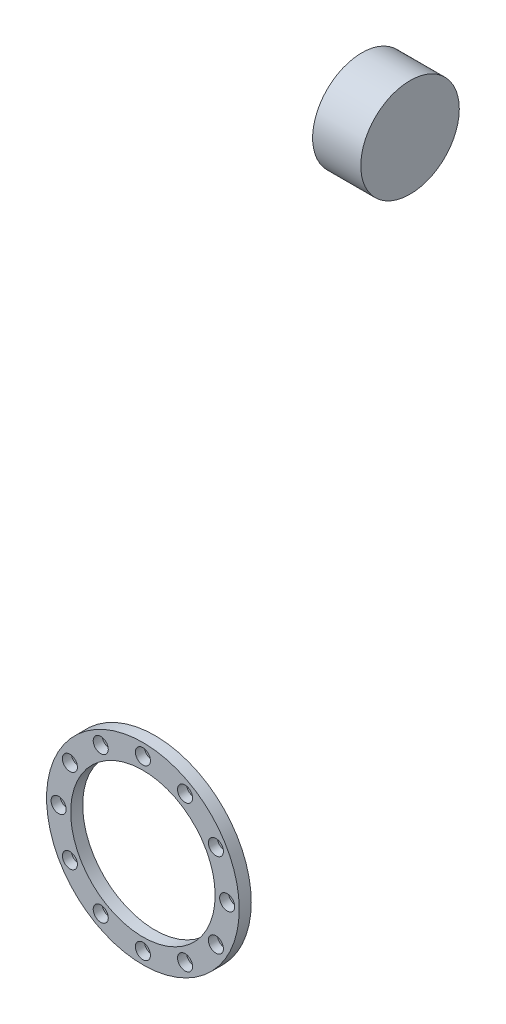
ISO-10303-21;
HEADER;
FILE_DESCRIPTION(('STEP AP214'),'2;1');
FILE_NAME('part.step','',(''),(''),'','','');
FILE_SCHEMA(('AUTOMOTIVE_DESIGN { 1 0 10303 214 1 1 1 1 }'));
ENDSEC;
DATA;
#1=APPLICATION_CONTEXT('core data for automotive mechanical design processes');
#2=APPLICATION_PROTOCOL_DEFINITION('international standard','automotive_design',2000,#1);
#3=PRODUCT_CONTEXT('',#1,'mechanical');
#4=PRODUCT('Part','Part','',(#3));
#5=PRODUCT_RELATED_PRODUCT_CATEGORY('part','',(#4));
#6=PRODUCT_DEFINITION_FORMATION('','',#4);
#7=PRODUCT_DEFINITION_CONTEXT('part definition',#1,'design');
#8=PRODUCT_DEFINITION('design','',#6,#7);
#9=PRODUCT_DEFINITION_SHAPE('','',#8);
#10=(LENGTH_UNIT() NAMED_UNIT(*) SI_UNIT(.MILLI.,.METRE.));
#11=(NAMED_UNIT(*) PLANE_ANGLE_UNIT() SI_UNIT($,.RADIAN.));
#12=(NAMED_UNIT(*) SI_UNIT($,.STERADIAN.) SOLID_ANGLE_UNIT());
#13=UNCERTAINTY_MEASURE_WITH_UNIT(LENGTH_MEASURE(1.E-05),#10,'distance_accuracy_value','');
#14=(GEOMETRIC_REPRESENTATION_CONTEXT(3) GLOBAL_UNCERTAINTY_ASSIGNED_CONTEXT((#13)) GLOBAL_UNIT_ASSIGNED_CONTEXT((#10,
#11,#12)) REPRESENTATION_CONTEXT('',''));
#15=CARTESIAN_POINT('',(0.,0.,0.));
#16=DIRECTION('',(0.,0.,1.));
#17=DIRECTION('',(1.,0.,0.));
#18=AXIS2_PLACEMENT_3D('',#15,#16,#17);
#19=CARTESIAN_POINT('',(25.4,538.724850834768,-243.653729545498));
#20=DIRECTION('',(-1.,0.,0.));
#21=DIRECTION('',(0.,0.,1.));
#22=AXIS2_PLACEMENT_3D('',#19,#20,#21);
#23=CYLINDRICAL_SURFACE('',#22,51.9453758681195);
#24=CARTESIAN_POINT('',(25.4,538.724850834768,-243.653729545498));
#25=DIRECTION('',(1.,0.,0.));
#26=DIRECTION('',(0.,0.,-1.));
#27=AXIS2_PLACEMENT_3D('',#24,#25,#26);
#28=CIRCLE('',#27,51.9453758681195);
#29=CARTESIAN_POINT('',(25.4,538.724850834768,-295.599105413618));
#30=VERTEX_POINT('',#29);
#31=EDGE_CURVE('E11',#30,#30,#28,.T.);
#32=ORIENTED_EDGE('',*,*,#31,.F.);
#33=EDGE_LOOP('',(#32));
#34=FACE_BOUND('',#33,.T.);
#35=CARTESIAN_POINT('',(-25.4,538.724850834768,-243.653729545498));
#36=DIRECTION('',(1.,0.,0.));
#37=DIRECTION('',(0.,0.,-1.));
#38=AXIS2_PLACEMENT_3D('',#35,#36,#37);
#39=CIRCLE('',#38,51.9453758681195);
#40=CARTESIAN_POINT('',(-25.4,538.724850834768,-295.599105413618));
#41=VERTEX_POINT('',#40);
#42=EDGE_CURVE('E49',#41,#41,#39,.T.);
#43=ORIENTED_EDGE('',*,*,#42,.T.);
#44=EDGE_LOOP('',(#43));
#45=FACE_BOUND('',#44,.T.);
#46=ADVANCED_FACE('F46',(#34,#45),#23,.T.);
#47=CARTESIAN_POINT('',(25.4,538.724850834768,-243.653729545498));
#48=DIRECTION('',(1.,0.,0.));
#49=DIRECTION('',(0.,0.,-1.));
#50=AXIS2_PLACEMENT_3D('',#47,#48,#49);
#51=PLANE('',#50);
#52=ORIENTED_EDGE('',*,*,#31,.T.);
#53=EDGE_LOOP('',(#52));
#54=FACE_BOUND('',#53,.T.);
#55=ADVANCED_FACE('F61',(#54),#51,.T.);
#56=CARTESIAN_POINT('',(-25.4,538.724850834768,-243.653729545498));
#57=DIRECTION('',(1.,0.,0.));
#58=DIRECTION('',(0.,0.,-1.));
#59=AXIS2_PLACEMENT_3D('',#56,#57,#58);
#60=PLANE('',#59);
#61=ORIENTED_EDGE('',*,*,#42,.F.);
#62=EDGE_LOOP('',(#61));
#63=FACE_BOUND('',#62,.T.);
#64=ADVANCED_FACE('F59',(#63),#60,.F.);
#65=CLOSED_SHELL('',(#46,#55,#64));
#66=MANIFOLD_SOLID_BREP('B2',#65);
#67=CARTESIAN_POINT('',(0.,0.,12.7));
#68=DIRECTION('',(0.,0.,1.));
#69=DIRECTION('',(1.,0.,0.));
#70=AXIS2_PLACEMENT_3D('',#67,#68,#69);
#71=PLANE('',#70);
#72=CARTESIAN_POINT('',(-76.9896583964367,44.4499999999998,12.7));
#73=DIRECTION('',(0.,0.,1.));
#74=DIRECTION('',(0.499999999999998,0.86602540378444,0.));
#75=AXIS2_PLACEMENT_3D('',#72,#73,#74);
#76=CIRCLE('',#75,7.9375);
#77=CARTESIAN_POINT('',(-73.0209083964367,51.3240766425388,12.7));
#78=VERTEX_POINT('',#77);
#79=EDGE_CURVE('E213',#78,#78,#76,.T.);
#80=ORIENTED_EDGE('',*,*,#79,.F.);
#81=EDGE_LOOP('',(#80));
#82=FACE_BOUND('',#81,.T.);
#83=CARTESIAN_POINT('',(-88.9,-3.10392691023155E-13,12.7));
#84=DIRECTION('',(0.,0.,1.));
#85=DIRECTION('',(0.,1.,0.));
#86=AXIS2_PLACEMENT_3D('',#83,#84,#85);
#87=CIRCLE('',#86,7.9375);
#88=CARTESIAN_POINT('',(-88.9,7.93749999999969,12.7));
#89=VERTEX_POINT('',#88);
#90=EDGE_CURVE('E201',#89,#89,#87,.T.);
#91=ORIENTED_EDGE('',*,*,#90,.F.);
#92=EDGE_LOOP('',(#91));
#93=FACE_BOUND('',#92,.T.);
#94=CARTESIAN_POINT('',(-76.9896583964364,-44.4500000000004,12.7));
#95=DIRECTION('',(0.,0.,1.));
#96=DIRECTION('',(-0.500000000000004,0.866025403784436,0.));
#97=AXIS2_PLACEMENT_3D('',#94,#95,#96);
#98=CIRCLE('',#97,7.9375);
#99=CARTESIAN_POINT('',(-80.9584083964364,-37.5759233574614,12.7));
#100=VERTEX_POINT('',#99);
#101=EDGE_CURVE('E189',#100,#100,#98,.T.);
#102=ORIENTED_EDGE('',*,*,#101,.F.);
#103=EDGE_LOOP('',(#102));
#104=FACE_BOUND('',#103,.T.);
#105=CARTESIAN_POINT('',(-44.4499999999995,-76.9896583964369,12.7));
#106=DIRECTION('',(0.,0.,1.));
#107=DIRECTION('',(-0.866025403784442,0.499999999999995,0.));
#108=AXIS2_PLACEMENT_3D('',#105,#106,#107);
#109=CIRCLE('',#108,7.9375);
#110=CARTESIAN_POINT('',(-51.3240766425386,-73.0209083964369,12.7));
#111=VERTEX_POINT('',#110);
#112=EDGE_CURVE('E177',#111,#111,#109,.T.);
#113=ORIENTED_EDGE('',*,*,#112,.F.);
#114=EDGE_LOOP('',(#113));
#115=FACE_BOUND('',#114,.T.);
#116=CARTESIAN_POINT('',(0.,-88.9,12.7));
#117=DIRECTION('',(0.,0.,1.));
#118=DIRECTION('',(-1.,0.,0.));
#119=AXIS2_PLACEMENT_3D('',#116,#117,#118);
#120=CIRCLE('',#119,7.9375);
#121=CARTESIAN_POINT('',(-7.9375,-88.9,12.7));
#122=VERTEX_POINT('',#121);
#123=EDGE_CURVE('E165',#122,#122,#120,.T.);
#124=ORIENTED_EDGE('',*,*,#123,.F.);
#125=EDGE_LOOP('',(#124));
#126=FACE_BOUND('',#125,.T.);
#127=CARTESIAN_POINT('',(44.4500000000006,-76.9896583964362,12.7));
#128=DIRECTION('',(0.,0.,1.));
#129=DIRECTION('',(-0.866025403784435,-0.500000000000007,0.));
#130=AXIS2_PLACEMENT_3D('',#127,#128,#129);
#131=CIRCLE('',#130,7.9375);
#132=CARTESIAN_POINT('',(37.5759233574617,-80.9584083964363,12.7));
#133=VERTEX_POINT('',#132);
#134=EDGE_CURVE('E153',#133,#133,#131,.T.);
#135=ORIENTED_EDGE('',*,*,#134,.F.);
#136=EDGE_LOOP('',(#135));
#137=FACE_BOUND('',#136,.T.);
#138=CARTESIAN_POINT('',(76.989658396437,-44.4499999999993,12.7));
#139=DIRECTION('',(0.,0.,1.));
#140=DIRECTION('',(-0.499999999999992,-0.866025403784443,0.));
#141=AXIS2_PLACEMENT_3D('',#138,#139,#140);
#142=CIRCLE('',#141,7.9375);
#143=CARTESIAN_POINT('',(73.0209083964371,-51.3240766425383,12.7));
#144=VERTEX_POINT('',#143);
#145=EDGE_CURVE('E139',#144,#144,#142,.T.);
#146=ORIENTED_EDGE('',*,*,#145,.F.);
#147=EDGE_LOOP('',(#146));
#148=FACE_BOUND('',#147,.T.);
#149=CARTESIAN_POINT('',(88.9,9.31178073069464E-13,12.7));
#150=DIRECTION('',(0.,0.,1.));
#151=DIRECTION('',(0.,-1.,0.));
#152=AXIS2_PLACEMENT_3D('',#149,#150,#151);
#153=CIRCLE('',#152,7.9375);
#154=CARTESIAN_POINT('',(88.9000000000001,-7.93749999999907,12.7));
#155=VERTEX_POINT('',#154);
#156=EDGE_CURVE('E146',#155,#155,#153,.T.);
#157=ORIENTED_EDGE('',*,*,#156,.F.);
#158=EDGE_LOOP('',(#157));
#159=FACE_BOUND('',#158,.T.);
#160=CARTESIAN_POINT('',(76.9896583964361,44.4500000000009,12.7));
#161=DIRECTION('',(0.,0.,1.));
#162=DIRECTION('',(0.50000000000001,-0.866025403784433,0.));
#163=AXIS2_PLACEMENT_3D('',#160,#161,#162);
#164=CIRCLE('',#163,7.9375);
#165=CARTESIAN_POINT('',(80.9584083964361,37.575923357462,12.7));
#166=VERTEX_POINT('',#165);
#167=EDGE_CURVE('E235',#166,#166,#164,.T.);
#168=ORIENTED_EDGE('',*,*,#167,.F.);
#169=EDGE_LOOP('',(#168));
#170=FACE_BOUND('',#169,.T.);
#171=CARTESIAN_POINT('',(44.449999999999,76.9896583964372,12.7));
#172=DIRECTION('',(0.,0.,1.));
#173=DIRECTION('',(0.866025403784445,-0.499999999999989,0.));
#174=AXIS2_PLACEMENT_3D('',#171,#172,#173);
#175=CIRCLE('',#174,7.9375);
#176=CARTESIAN_POINT('',(51.324076642538,73.0209083964372,12.7));
#177=VERTEX_POINT('',#176);
#178=EDGE_CURVE('E242',#177,#177,#175,.T.);
#179=ORIENTED_EDGE('',*,*,#178,.F.);
#180=EDGE_LOOP('',(#179));
#181=FACE_BOUND('',#180,.T.);
#182=CARTESIAN_POINT('',(-44.4500000000001,76.9896583964365,12.7));
#183=DIRECTION('',(0.,0.,1.));
#184=DIRECTION('',(0.866025403784438,0.500000000000001,0.));
#185=AXIS2_PLACEMENT_3D('',#182,#183,#184);
#186=CIRCLE('',#185,7.9375);
#187=CARTESIAN_POINT('',(-37.5759233574611,80.9584083964365,12.7));
#188=VERTEX_POINT('',#187);
#189=EDGE_CURVE('E132',#188,#188,#186,.T.);
#190=ORIENTED_EDGE('',*,*,#189,.F.);
#191=EDGE_LOOP('',(#190));
#192=FACE_BOUND('',#191,.T.);
#193=CARTESIAN_POINT('',(0.,88.9,12.7));
#194=DIRECTION('',(0.,0.,1.));
#195=DIRECTION('',(1.,0.,0.));
#196=AXIS2_PLACEMENT_3D('',#193,#194,#195);
#197=CIRCLE('',#196,7.9375);
#198=CARTESIAN_POINT('',(7.9375,88.9,12.7));
#199=VERTEX_POINT('',#198);
#200=EDGE_CURVE('E120',#199,#199,#197,.T.);
#201=ORIENTED_EDGE('',*,*,#200,.F.);
#202=EDGE_LOOP('',(#201));
#203=FACE_BOUND('',#202,.T.);
#204=CARTESIAN_POINT('',(0.,0.,12.7));
#205=DIRECTION('',(0.,0.,1.));
#206=DIRECTION('',(1.,0.,0.));
#207=AXIS2_PLACEMENT_3D('',#204,#205,#206);
#208=CIRCLE('',#207,101.6);
#209=CARTESIAN_POINT('',(101.6,0.,12.7));
#210=VERTEX_POINT('',#209);
#211=EDGE_CURVE('E45',#210,#210,#208,.T.);
#212=ORIENTED_EDGE('',*,*,#211,.T.);
#213=EDGE_LOOP('',(#212));
#214=FACE_BOUND('',#213,.T.);
#215=CARTESIAN_POINT('',(0.,0.,12.7));
#216=DIRECTION('',(0.,0.,1.));
#217=DIRECTION('',(1.,0.,0.));
#218=AXIS2_PLACEMENT_3D('',#215,#216,#217);
#219=CIRCLE('',#218,76.2);
#220=CARTESIAN_POINT('',(76.2,0.,12.7));
#221=VERTEX_POINT('',#220);
#222=EDGE_CURVE('E104',#221,#221,#219,.T.);
#223=ORIENTED_EDGE('',*,*,#222,.F.);
#224=EDGE_LOOP('',(#223));
#225=FACE_BOUND('',#224,.T.);
#226=ADVANCED_FACE('F93',(#82,#93,#104,#115,#126,#137,#148,#159,#170,#181,#192,#203,#214,#225),
#71,.T.);
#227=CARTESIAN_POINT('',(0.,0.,0.));
#228=DIRECTION('',(0.,0.,1.));
#229=DIRECTION('',(1.,0.,0.));
#230=AXIS2_PLACEMENT_3D('',#227,#228,#229);
#231=PLANE('',#230);
#232=CARTESIAN_POINT('',(-76.9896583964367,44.4499999999998,0.));
#233=DIRECTION('',(0.,0.,1.));
#234=DIRECTION('',(0.499999999999998,0.86602540378444,0.));
#235=AXIS2_PLACEMENT_3D('',#232,#233,#234);
#236=CIRCLE('',#235,5.0419);
#237=CARTESIAN_POINT('',(-74.4687083964367,48.8164134833406,0.));
#238=VERTEX_POINT('',#237);
#239=EDGE_CURVE('E227',#238,#238,#236,.T.);
#240=ORIENTED_EDGE('',*,*,#239,.T.);
#241=EDGE_LOOP('',(#240));
#242=FACE_BOUND('',#241,.T.);
#243=CARTESIAN_POINT('',(-88.9,-3.10392691023155E-13,0.));
#244=DIRECTION('',(0.,0.,1.));
#245=DIRECTION('',(0.,1.,0.));
#246=AXIS2_PLACEMENT_3D('',#243,#244,#245);
#247=CIRCLE('',#246,5.0419);
#248=CARTESIAN_POINT('',(-88.9,5.04189999999969,0.));
#249=VERTEX_POINT('',#248);
#250=EDGE_CURVE('E217',#249,#249,#247,.T.);
#251=ORIENTED_EDGE('',*,*,#250,.T.);
#252=EDGE_LOOP('',(#251));
#253=FACE_BOUND('',#252,.T.);
#254=CARTESIAN_POINT('',(-76.9896583964364,-44.4500000000004,0.));
#255=DIRECTION('',(0.,0.,1.));
#256=DIRECTION('',(-0.500000000000004,0.866025403784436,0.));
#257=AXIS2_PLACEMENT_3D('',#254,#255,#256);
#258=CIRCLE('',#257,5.0419);
#259=CARTESIAN_POINT('',(-79.5106083964364,-40.0835865166596,0.));
#260=VERTEX_POINT('',#259);
#261=EDGE_CURVE('E205',#260,#260,#258,.T.);
#262=ORIENTED_EDGE('',*,*,#261,.T.);
#263=EDGE_LOOP('',(#262));
#264=FACE_BOUND('',#263,.T.);
#265=CARTESIAN_POINT('',(-44.4499999999995,-76.9896583964369,0.));
#266=DIRECTION('',(0.,0.,1.));
#267=DIRECTION('',(-0.866025403784442,0.499999999999995,0.));
#268=AXIS2_PLACEMENT_3D('',#265,#266,#267);
#269=CIRCLE('',#268,5.0419);
#270=CARTESIAN_POINT('',(-48.8164134833403,-74.4687083964369,0.));
#271=VERTEX_POINT('',#270);
#272=EDGE_CURVE('E193',#271,#271,#269,.T.);
#273=ORIENTED_EDGE('',*,*,#272,.T.);
#274=EDGE_LOOP('',(#273));
#275=FACE_BOUND('',#274,.T.);
#276=CARTESIAN_POINT('',(0.,-88.9,0.));
#277=DIRECTION('',(0.,0.,1.));
#278=DIRECTION('',(-1.,0.,0.));
#279=AXIS2_PLACEMENT_3D('',#276,#277,#278);
#280=CIRCLE('',#279,5.0419);
#281=CARTESIAN_POINT('',(-5.0419,-88.9,0.));
#282=VERTEX_POINT('',#281);
#283=EDGE_CURVE('E181',#282,#282,#280,.T.);
#284=ORIENTED_EDGE('',*,*,#283,.T.);
#285=EDGE_LOOP('',(#284));
#286=FACE_BOUND('',#285,.T.);
#287=CARTESIAN_POINT('',(44.4500000000006,-76.9896583964362,0.));
#288=DIRECTION('',(0.,0.,1.));
#289=DIRECTION('',(-0.866025403784435,-0.500000000000007,0.));
#290=AXIS2_PLACEMENT_3D('',#287,#288,#289);
#291=CIRCLE('',#290,5.0419);
#292=CARTESIAN_POINT('',(40.0835865166599,-79.5106083964363,0.));
#293=VERTEX_POINT('',#292);
#294=EDGE_CURVE('E169',#293,#293,#291,.T.);
#295=ORIENTED_EDGE('',*,*,#294,.T.);
#296=EDGE_LOOP('',(#295));
#297=FACE_BOUND('',#296,.T.);
#298=CARTESIAN_POINT('',(76.989658396437,-44.4499999999993,0.));
#299=DIRECTION('',(0.,0.,1.));
#300=DIRECTION('',(-0.499999999999992,-0.866025403784443,0.));
#301=AXIS2_PLACEMENT_3D('',#298,#299,#300);
#302=CIRCLE('',#301,5.0419);
#303=CARTESIAN_POINT('',(74.4687083964371,-48.8164134833401,0.));
#304=VERTEX_POINT('',#303);
#305=EDGE_CURVE('E157',#304,#304,#302,.T.);
#306=ORIENTED_EDGE('',*,*,#305,.T.);
#307=EDGE_LOOP('',(#306));
#308=FACE_BOUND('',#307,.T.);
#309=CARTESIAN_POINT('',(88.9,9.31178073069464E-13,0.));
#310=DIRECTION('',(0.,0.,1.));
#311=DIRECTION('',(0.,-1.,0.));
#312=AXIS2_PLACEMENT_3D('',#309,#310,#311);
#313=CIRCLE('',#312,5.0419);
#314=CARTESIAN_POINT('',(88.9,-5.04189999999906,0.));
#315=VERTEX_POINT('',#314);
#316=EDGE_CURVE('E143',#315,#315,#313,.T.);
#317=ORIENTED_EDGE('',*,*,#316,.T.);
#318=EDGE_LOOP('',(#317));
#319=FACE_BOUND('',#318,.T.);
#320=CARTESIAN_POINT('',(76.9896583964361,44.4500000000009,0.));
#321=DIRECTION('',(0.,0.,1.));
#322=DIRECTION('',(0.50000000000001,-0.866025403784433,0.));
#323=AXIS2_PLACEMENT_3D('',#320,#321,#322);
#324=CIRCLE('',#323,5.0419);
#325=CARTESIAN_POINT('',(79.5106083964361,40.0835865166602,0.));
#326=VERTEX_POINT('',#325);
#327=EDGE_CURVE('E250',#326,#326,#324,.T.);
#328=ORIENTED_EDGE('',*,*,#327,.T.);
#329=EDGE_LOOP('',(#328));
#330=FACE_BOUND('',#329,.T.);
#331=CARTESIAN_POINT('',(44.449999999999,76.9896583964372,0.));
#332=DIRECTION('',(0.,0.,1.));
#333=DIRECTION('',(0.866025403784445,-0.499999999999989,0.));
#334=AXIS2_PLACEMENT_3D('',#331,#332,#333);
#335=CIRCLE('',#334,5.0419);
#336=CARTESIAN_POINT('',(48.8164134833398,74.4687083964372,0.));
#337=VERTEX_POINT('',#336);
#338=EDGE_CURVE('E239',#337,#337,#335,.T.);
#339=ORIENTED_EDGE('',*,*,#338,.T.);
#340=EDGE_LOOP('',(#339));
#341=FACE_BOUND('',#340,.T.);
#342=CARTESIAN_POINT('',(-44.4500000000001,76.9896583964365,0.));
#343=DIRECTION('',(0.,0.,1.));
#344=DIRECTION('',(0.866025403784438,0.500000000000001,0.));
#345=AXIS2_PLACEMENT_3D('',#342,#343,#344);
#346=CIRCLE('',#345,5.0419);
#347=CARTESIAN_POINT('',(-40.0835865166593,79.5106083964366,0.));
#348=VERTEX_POINT('',#347);
#349=EDGE_CURVE('E129',#348,#348,#346,.T.);
#350=ORIENTED_EDGE('',*,*,#349,.T.);
#351=EDGE_LOOP('',(#350));
#352=FACE_BOUND('',#351,.T.);
#353=CARTESIAN_POINT('',(0.,88.9,0.));
#354=DIRECTION('',(0.,0.,1.));
#355=DIRECTION('',(1.,0.,0.));
#356=AXIS2_PLACEMENT_3D('',#353,#354,#355);
#357=CIRCLE('',#356,5.0419);
#358=CARTESIAN_POINT('',(5.0419,88.9,0.));
#359=VERTEX_POINT('',#358);
#360=EDGE_CURVE('E109',#359,#359,#357,.T.);
#361=ORIENTED_EDGE('',*,*,#360,.T.);
#362=EDGE_LOOP('',(#361));
#363=FACE_BOUND('',#362,.T.);
#364=CARTESIAN_POINT('',(0.,0.,0.));
#365=DIRECTION('',(0.,0.,1.));
#366=DIRECTION('',(1.,0.,0.));
#367=AXIS2_PLACEMENT_3D('',#364,#365,#366);
#368=CIRCLE('',#367,101.6);
#369=CARTESIAN_POINT('',(101.6,0.,0.));
#370=VERTEX_POINT('',#369);
#371=EDGE_CURVE('E97',#370,#370,#368,.T.);
#372=ORIENTED_EDGE('',*,*,#371,.F.);
#373=EDGE_LOOP('',(#372));
#374=FACE_BOUND('',#373,.T.);
#375=CARTESIAN_POINT('',(0.,0.,0.));
#376=DIRECTION('',(0.,0.,1.));
#377=DIRECTION('',(1.,0.,0.));
#378=AXIS2_PLACEMENT_3D('',#375,#376,#377);
#379=CIRCLE('',#378,76.2);
#380=CARTESIAN_POINT('',(76.2,0.,0.));
#381=VERTEX_POINT('',#380);
#382=EDGE_CURVE('E106',#381,#381,#379,.T.);
#383=ORIENTED_EDGE('',*,*,#382,.T.);
#384=EDGE_LOOP('',(#383));
#385=FACE_BOUND('',#384,.T.);
#386=ADVANCED_FACE('F260',(#242,#253,#264,#275,#286,#297,#308,#319,#330,#341,#352,#363,#374,
#385),#231,.F.);
#387=CARTESIAN_POINT('',(0.,0.,12.7));
#388=DIRECTION('',(0.,0.,-1.));
#389=DIRECTION('',(-1.,0.,0.));
#390=AXIS2_PLACEMENT_3D('',#387,#388,#389);
#391=CYLINDRICAL_SURFACE('',#390,101.6);
#392=ORIENTED_EDGE('',*,*,#211,.F.);
#393=EDGE_LOOP('',(#392));
#394=FACE_BOUND('',#393,.T.);
#395=ORIENTED_EDGE('',*,*,#371,.T.);
#396=EDGE_LOOP('',(#395));
#397=FACE_BOUND('',#396,.T.);
#398=ADVANCED_FACE('F95',(#394,#397),#391,.T.);
#399=CARTESIAN_POINT('',(0.,0.,12.7));
#400=DIRECTION('',(0.,0.,-1.));
#401=DIRECTION('',(-1.,0.,0.));
#402=AXIS2_PLACEMENT_3D('',#399,#400,#401);
#403=CYLINDRICAL_SURFACE('',#402,76.2);
#404=ORIENTED_EDGE('',*,*,#222,.T.);
#405=EDGE_LOOP('',(#404));
#406=FACE_BOUND('',#405,.T.);
#407=ORIENTED_EDGE('',*,*,#382,.F.);
#408=EDGE_LOOP('',(#407));
#409=FACE_BOUND('',#408,.T.);
#410=ADVANCED_FACE('F271',(#406,#409),#403,.F.);
#411=CARTESIAN_POINT('',(0.,88.9,12.7));
#412=DIRECTION('',(0.,0.,1.));
#413=DIRECTION('',(1.,0.,0.));
#414=AXIS2_PLACEMENT_3D('',#411,#412,#413);
#415=CYLINDRICAL_SURFACE('',#414,5.0419);
#416=ORIENTED_EDGE('',*,*,#360,.F.);
#417=EDGE_LOOP('',(#416));
#418=FACE_BOUND('',#417,.T.);
#419=CARTESIAN_POINT('',(0.,88.9,3.175));
#420=DIRECTION('',(0.,0.,1.));
#421=DIRECTION('',(1.,0.,0.));
#422=AXIS2_PLACEMENT_3D('',#419,#420,#421);
#423=CIRCLE('',#422,5.0419);
#424=CARTESIAN_POINT('',(5.0419,88.9,3.175));
#425=VERTEX_POINT('',#424);
#426=EDGE_CURVE('E114',#425,#425,#423,.T.);
#427=ORIENTED_EDGE('',*,*,#426,.T.);
#428=EDGE_LOOP('',(#427));
#429=FACE_BOUND('',#428,.T.);
#430=ADVANCED_FACE('F274',(#418,#429),#415,.F.);
#431=CARTESIAN_POINT('',(5.0419,88.9,3.175));
#432=DIRECTION('',(0.,0.,-1.));
#433=DIRECTION('',(-1.,0.,0.));
#434=AXIS2_PLACEMENT_3D('',#431,#432,#433);
#435=PLANE('',#434);
#436=ORIENTED_EDGE('',*,*,#426,.F.);
#437=EDGE_LOOP('',(#436));
#438=FACE_BOUND('',#437,.T.);
#439=CARTESIAN_POINT('',(0.,88.9,3.175));
#440=DIRECTION('',(0.,0.,1.));
#441=DIRECTION('',(1.,0.,0.));
#442=AXIS2_PLACEMENT_3D('',#439,#440,#441);
#443=CIRCLE('',#442,7.9375);
#444=CARTESIAN_POINT('',(7.9375,88.9,3.175));
#445=VERTEX_POINT('',#444);
#446=EDGE_CURVE('E117',#445,#445,#443,.T.);
#447=ORIENTED_EDGE('',*,*,#446,.T.);
#448=EDGE_LOOP('',(#447));
#449=FACE_BOUND('',#448,.T.);
#450=ADVANCED_FACE('F288',(#438,#449),#435,.F.);
#451=CARTESIAN_POINT('',(0.,88.9,12.7));
#452=DIRECTION('',(0.,0.,1.));
#453=DIRECTION('',(1.,0.,0.));
#454=AXIS2_PLACEMENT_3D('',#451,#452,#453);
#455=CYLINDRICAL_SURFACE('',#454,7.9375);
#456=ORIENTED_EDGE('',*,*,#446,.F.);
#457=EDGE_LOOP('',(#456));
#458=FACE_BOUND('',#457,.T.);
#459=ORIENTED_EDGE('',*,*,#200,.T.);
#460=EDGE_LOOP('',(#459));
#461=FACE_BOUND('',#460,.T.);
#462=ADVANCED_FACE('F292',(#458,#461),#455,.F.);
#463=CARTESIAN_POINT('',(-44.4500000000001,76.9896583964365,12.7));
#464=DIRECTION('',(0.,0.,1.));
#465=DIRECTION('',(0.866025403784438,0.500000000000001,0.));
#466=AXIS2_PLACEMENT_3D('',#463,#464,#465);
#467=CYLINDRICAL_SURFACE('',#466,5.0419);
#468=ORIENTED_EDGE('',*,*,#349,.F.);
#469=EDGE_LOOP('',(#468));
#470=FACE_BOUND('',#469,.T.);
#471=CARTESIAN_POINT('',(-44.4500000000001,76.9896583964365,3.175));
#472=DIRECTION('',(0.,0.,1.));
#473=DIRECTION('',(0.866025403784438,0.500000000000001,0.));
#474=AXIS2_PLACEMENT_3D('',#471,#472,#473);
#475=CIRCLE('',#474,5.0419);
#476=CARTESIAN_POINT('',(-40.0835865166593,79.5106083964366,3.175));
#477=VERTEX_POINT('',#476);
#478=EDGE_CURVE('E123',#477,#477,#475,.T.);
#479=ORIENTED_EDGE('',*,*,#478,.T.);
#480=EDGE_LOOP('',(#479));
#481=FACE_BOUND('',#480,.T.);
#482=ADVANCED_FACE('F296',(#470,#481),#467,.F.);
#483=CARTESIAN_POINT('',(-40.0835865166593,79.5106083964366,3.175));
#484=DIRECTION('',(0.,0.,-1.));
#485=DIRECTION('',(-0.866025403784438,-0.500000000000001,0.));
#486=AXIS2_PLACEMENT_3D('',#483,#484,#485);
#487=PLANE('',#486);
#488=ORIENTED_EDGE('',*,*,#478,.F.);
#489=EDGE_LOOP('',(#488));
#490=FACE_BOUND('',#489,.T.);
#491=CARTESIAN_POINT('',(-44.4500000000001,76.9896583964365,3.175));
#492=DIRECTION('',(0.,0.,1.));
#493=DIRECTION('',(0.866025403784438,0.500000000000001,0.));
#494=AXIS2_PLACEMENT_3D('',#491,#492,#493);
#495=CIRCLE('',#494,7.9375);
#496=CARTESIAN_POINT('',(-37.5759233574611,80.9584083964365,3.175));
#497=VERTEX_POINT('',#496);
#498=EDGE_CURVE('E126',#497,#497,#495,.T.);
#499=ORIENTED_EDGE('',*,*,#498,.T.);
#500=EDGE_LOOP('',(#499));
#501=FACE_BOUND('',#500,.T.);
#502=ADVANCED_FACE('F300',(#490,#501),#487,.F.);
#503=CARTESIAN_POINT('',(-44.4500000000001,76.9896583964365,12.7));
#504=DIRECTION('',(0.,0.,1.));
#505=DIRECTION('',(0.866025403784438,0.500000000000001,0.));
#506=AXIS2_PLACEMENT_3D('',#503,#504,#505);
#507=CYLINDRICAL_SURFACE('',#506,7.9375);
#508=ORIENTED_EDGE('',*,*,#498,.F.);
#509=EDGE_LOOP('',(#508));
#510=FACE_BOUND('',#509,.T.);
#511=ORIENTED_EDGE('',*,*,#189,.T.);
#512=EDGE_LOOP('',(#511));
#513=FACE_BOUND('',#512,.T.);
#514=ADVANCED_FACE('F304',(#510,#513),#507,.F.);
#515=CARTESIAN_POINT('',(44.449999999999,76.9896583964372,12.7));
#516=DIRECTION('',(0.,0.,1.));
#517=DIRECTION('',(0.866025403784445,-0.499999999999989,0.));
#518=AXIS2_PLACEMENT_3D('',#515,#516,#517);
#519=CYLINDRICAL_SURFACE('',#518,5.0419);
#520=ORIENTED_EDGE('',*,*,#338,.F.);
#521=EDGE_LOOP('',(#520));
#522=FACE_BOUND('',#521,.T.);
#523=CARTESIAN_POINT('',(44.449999999999,76.9896583964372,3.175));
#524=DIRECTION('',(0.,0.,1.));
#525=DIRECTION('',(0.866025403784445,-0.499999999999989,0.));
#526=AXIS2_PLACEMENT_3D('',#523,#524,#525);
#527=CIRCLE('',#526,5.0419);
#528=CARTESIAN_POINT('',(48.8164134833398,74.4687083964372,3.175));
#529=VERTEX_POINT('',#528);
#530=EDGE_CURVE('E232',#529,#529,#527,.T.);
#531=ORIENTED_EDGE('',*,*,#530,.T.);
#532=EDGE_LOOP('',(#531));
#533=FACE_BOUND('',#532,.T.);
#534=ADVANCED_FACE('F308',(#522,#533),#519,.F.);
#535=CARTESIAN_POINT('',(48.8164134833398,74.4687083964372,3.175));
#536=DIRECTION('',(0.,0.,-1.));
#537=DIRECTION('',(-0.866025403784445,0.499999999999989,0.));
#538=AXIS2_PLACEMENT_3D('',#535,#536,#537);
#539=PLANE('',#538);
#540=ORIENTED_EDGE('',*,*,#530,.F.);
#541=EDGE_LOOP('',(#540));
#542=FACE_BOUND('',#541,.T.);
#543=CARTESIAN_POINT('',(44.449999999999,76.9896583964372,3.175));
#544=DIRECTION('',(0.,0.,1.));
#545=DIRECTION('',(0.866025403784445,-0.499999999999989,0.));
#546=AXIS2_PLACEMENT_3D('',#543,#544,#545);
#547=CIRCLE('',#546,7.9375);
#548=CARTESIAN_POINT('',(51.324076642538,73.0209083964372,3.175));
#549=VERTEX_POINT('',#548);
#550=EDGE_CURVE('E236',#549,#549,#547,.T.);
#551=ORIENTED_EDGE('',*,*,#550,.T.);
#552=EDGE_LOOP('',(#551));
#553=FACE_BOUND('',#552,.T.);
#554=ADVANCED_FACE('F408',(#542,#553),#539,.F.);
#555=CARTESIAN_POINT('',(44.449999999999,76.9896583964372,12.7));
#556=DIRECTION('',(0.,0.,1.));
#557=DIRECTION('',(0.866025403784445,-0.499999999999989,0.));
#558=AXIS2_PLACEMENT_3D('',#555,#556,#557);
#559=CYLINDRICAL_SURFACE('',#558,7.9375);
#560=ORIENTED_EDGE('',*,*,#550,.F.);
#561=EDGE_LOOP('',(#560));
#562=FACE_BOUND('',#561,.T.);
#563=ORIENTED_EDGE('',*,*,#178,.T.);
#564=EDGE_LOOP('',(#563));
#565=FACE_BOUND('',#564,.T.);
#566=ADVANCED_FACE('F412',(#562,#565),#559,.F.);
#567=CARTESIAN_POINT('',(76.9896583964361,44.4500000000009,12.7));
#568=DIRECTION('',(0.,0.,1.));
#569=DIRECTION('',(0.50000000000001,-0.866025403784433,0.));
#570=AXIS2_PLACEMENT_3D('',#567,#568,#569);
#571=CYLINDRICAL_SURFACE('',#570,5.0419);
#572=ORIENTED_EDGE('',*,*,#327,.F.);
#573=EDGE_LOOP('',(#572));
#574=FACE_BOUND('',#573,.T.);
#575=CARTESIAN_POINT('',(76.9896583964361,44.4500000000009,3.175));
#576=DIRECTION('',(0.,0.,1.));
#577=DIRECTION('',(0.50000000000001,-0.866025403784433,0.));
#578=AXIS2_PLACEMENT_3D('',#575,#576,#577);
#579=CIRCLE('',#578,5.0419);
#580=CARTESIAN_POINT('',(79.5106083964361,40.0835865166602,3.175));
#581=VERTEX_POINT('',#580);
#582=EDGE_CURVE('E149',#581,#581,#579,.T.);
#583=ORIENTED_EDGE('',*,*,#582,.T.);
#584=EDGE_LOOP('',(#583));
#585=FACE_BOUND('',#584,.T.);
#586=ADVANCED_FACE('F416',(#574,#585),#571,.F.);
#587=CARTESIAN_POINT('',(79.5106083964361,40.0835865166602,3.175));
#588=DIRECTION('',(0.,0.,-1.));
#589=DIRECTION('',(-0.50000000000001,0.866025403784433,0.));
#590=AXIS2_PLACEMENT_3D('',#587,#588,#589);
#591=PLANE('',#590);
#592=ORIENTED_EDGE('',*,*,#582,.F.);
#593=EDGE_LOOP('',(#592));
#594=FACE_BOUND('',#593,.T.);
#595=CARTESIAN_POINT('',(76.9896583964361,44.4500000000009,3.175));
#596=DIRECTION('',(0.,0.,1.));
#597=DIRECTION('',(0.50000000000001,-0.866025403784433,0.));
#598=AXIS2_PLACEMENT_3D('',#595,#596,#597);
#599=CIRCLE('',#598,7.9375);
#600=CARTESIAN_POINT('',(80.9584083964361,37.575923357462,3.175));
#601=VERTEX_POINT('',#600);
#602=EDGE_CURVE('E247',#601,#601,#599,.T.);
#603=ORIENTED_EDGE('',*,*,#602,.T.);
#604=EDGE_LOOP('',(#603));
#605=FACE_BOUND('',#604,.T.);
#606=ADVANCED_FACE('F420',(#594,#605),#591,.F.);
#607=CARTESIAN_POINT('',(76.9896583964361,44.4500000000009,12.7));
#608=DIRECTION('',(0.,0.,1.));
#609=DIRECTION('',(0.50000000000001,-0.866025403784433,0.));
#610=AXIS2_PLACEMENT_3D('',#607,#608,#609);
#611=CYLINDRICAL_SURFACE('',#610,7.9375);
#612=ORIENTED_EDGE('',*,*,#602,.F.);
#613=EDGE_LOOP('',(#612));
#614=FACE_BOUND('',#613,.T.);
#615=ORIENTED_EDGE('',*,*,#167,.T.);
#616=EDGE_LOOP('',(#615));
#617=FACE_BOUND('',#616,.T.);
#618=ADVANCED_FACE('F256',(#614,#617),#611,.F.);
#619=CARTESIAN_POINT('',(88.9,9.31178073069464E-13,12.7));
#620=DIRECTION('',(0.,0.,1.));
#621=DIRECTION('',(0.,-1.,0.));
#622=AXIS2_PLACEMENT_3D('',#619,#620,#621);
#623=CYLINDRICAL_SURFACE('',#622,5.0419);
#624=ORIENTED_EDGE('',*,*,#316,.F.);
#625=EDGE_LOOP('',(#624));
#626=FACE_BOUND('',#625,.T.);
#627=CARTESIAN_POINT('',(88.9,9.31178073069464E-13,3.175));
#628=DIRECTION('',(0.,0.,1.));
#629=DIRECTION('',(0.,-1.,0.));
#630=AXIS2_PLACEMENT_3D('',#627,#628,#629);
#631=CIRCLE('',#630,5.0419);
#632=CARTESIAN_POINT('',(88.9,-5.04189999999907,3.175));
#633=VERTEX_POINT('',#632);
#634=EDGE_CURVE('E136',#633,#633,#631,.T.);
#635=ORIENTED_EDGE('',*,*,#634,.T.);
#636=EDGE_LOOP('',(#635));
#637=FACE_BOUND('',#636,.T.);
#638=ADVANCED_FACE('F310',(#626,#637),#623,.F.);
#639=CARTESIAN_POINT('',(88.9,-5.04189999999907,3.175));
#640=DIRECTION('',(0.,0.,-1.));
#641=DIRECTION('',(0.,1.,0.));
#642=AXIS2_PLACEMENT_3D('',#639,#640,#641);
#643=PLANE('',#642);
#644=ORIENTED_EDGE('',*,*,#634,.F.);
#645=EDGE_LOOP('',(#644));
#646=FACE_BOUND('',#645,.T.);
#647=CARTESIAN_POINT('',(88.9,9.31178073069464E-13,3.175));
#648=DIRECTION('',(0.,0.,1.));
#649=DIRECTION('',(0.,-1.,0.));
#650=AXIS2_PLACEMENT_3D('',#647,#648,#649);
#651=CIRCLE('',#650,7.9375);
#652=CARTESIAN_POINT('',(88.9000000000001,-7.93749999999907,3.175));
#653=VERTEX_POINT('',#652);
#654=EDGE_CURVE('E140',#653,#653,#651,.T.);
#655=ORIENTED_EDGE('',*,*,#654,.T.);
#656=EDGE_LOOP('',(#655));
#657=FACE_BOUND('',#656,.T.);
#658=ADVANCED_FACE('F313',(#646,#657),#643,.F.);
#659=CARTESIAN_POINT('',(88.9,9.31178073069464E-13,12.7));
#660=DIRECTION('',(0.,0.,1.));
#661=DIRECTION('',(0.,-1.,0.));
#662=AXIS2_PLACEMENT_3D('',#659,#660,#661);
#663=CYLINDRICAL_SURFACE('',#662,7.9375);
#664=ORIENTED_EDGE('',*,*,#654,.F.);
#665=EDGE_LOOP('',(#664));
#666=FACE_BOUND('',#665,.T.);
#667=ORIENTED_EDGE('',*,*,#156,.T.);
#668=EDGE_LOOP('',(#667));
#669=FACE_BOUND('',#668,.T.);
#670=ADVANCED_FACE('F317',(#666,#669),#663,.F.);
#671=CARTESIAN_POINT('',(76.989658396437,-44.4499999999993,12.7));
#672=DIRECTION('',(0.,0.,1.));
#673=DIRECTION('',(-0.499999999999992,-0.866025403784443,0.));
#674=AXIS2_PLACEMENT_3D('',#671,#672,#673);
#675=CYLINDRICAL_SURFACE('',#674,5.0419);
#676=ORIENTED_EDGE('',*,*,#305,.F.);
#677=EDGE_LOOP('',(#676));
#678=FACE_BOUND('',#677,.T.);
#679=CARTESIAN_POINT('',(76.989658396437,-44.4499999999993,3.175));
#680=DIRECTION('',(0.,0.,1.));
#681=DIRECTION('',(-0.499999999999992,-0.866025403784443,0.));
#682=AXIS2_PLACEMENT_3D('',#679,#680,#681);
#683=CIRCLE('',#682,5.0419);
#684=CARTESIAN_POINT('',(74.4687083964371,-48.8164134833401,3.175));
#685=VERTEX_POINT('',#684);
#686=EDGE_CURVE('E150',#685,#685,#683,.T.);
#687=ORIENTED_EDGE('',*,*,#686,.T.);
#688=EDGE_LOOP('',(#687));
#689=FACE_BOUND('',#688,.T.);
#690=ADVANCED_FACE('F321',(#678,#689),#675,.F.);
#691=CARTESIAN_POINT('',(74.4687083964371,-48.8164134833401,3.175));
#692=DIRECTION('',(0.,0.,-1.));
#693=DIRECTION('',(0.499999999999992,0.866025403784443,0.));
#694=AXIS2_PLACEMENT_3D('',#691,#692,#693);
#695=PLANE('',#694);
#696=ORIENTED_EDGE('',*,*,#686,.F.);
#697=EDGE_LOOP('',(#696));
#698=FACE_BOUND('',#697,.T.);
#699=CARTESIAN_POINT('',(76.989658396437,-44.4499999999993,3.175));
#700=DIRECTION('',(0.,0.,1.));
#701=DIRECTION('',(-0.499999999999992,-0.866025403784443,0.));
#702=AXIS2_PLACEMENT_3D('',#699,#700,#701);
#703=CIRCLE('',#702,7.9375);
#704=CARTESIAN_POINT('',(73.0209083964371,-51.3240766425383,3.175));
#705=VERTEX_POINT('',#704);
#706=EDGE_CURVE('E154',#705,#705,#703,.T.);
#707=ORIENTED_EDGE('',*,*,#706,.T.);
#708=EDGE_LOOP('',(#707));
#709=FACE_BOUND('',#708,.T.);
#710=ADVANCED_FACE('F325',(#698,#709),#695,.F.);
#711=CARTESIAN_POINT('',(76.989658396437,-44.4499999999993,12.7));
#712=DIRECTION('',(0.,0.,1.));
#713=DIRECTION('',(-0.499999999999992,-0.866025403784443,0.));
#714=AXIS2_PLACEMENT_3D('',#711,#712,#713);
#715=CYLINDRICAL_SURFACE('',#714,7.9375);
#716=ORIENTED_EDGE('',*,*,#706,.F.);
#717=EDGE_LOOP('',(#716));
#718=FACE_BOUND('',#717,.T.);
#719=ORIENTED_EDGE('',*,*,#145,.T.);
#720=EDGE_LOOP('',(#719));
#721=FACE_BOUND('',#720,.T.);
#722=ADVANCED_FACE('F329',(#718,#721),#715,.F.);
#723=CARTESIAN_POINT('',(44.4500000000006,-76.9896583964362,12.7));
#724=DIRECTION('',(0.,0.,1.));
#725=DIRECTION('',(-0.866025403784435,-0.500000000000007,0.));
#726=AXIS2_PLACEMENT_3D('',#723,#724,#725);
#727=CYLINDRICAL_SURFACE('',#726,5.0419);
#728=ORIENTED_EDGE('',*,*,#294,.F.);
#729=EDGE_LOOP('',(#728));
#730=FACE_BOUND('',#729,.T.);
#731=CARTESIAN_POINT('',(44.4500000000006,-76.9896583964362,3.175));
#732=DIRECTION('',(0.,0.,1.));
#733=DIRECTION('',(-0.866025403784435,-0.500000000000007,0.));
#734=AXIS2_PLACEMENT_3D('',#731,#732,#733);
#735=CIRCLE('',#734,5.0419);
#736=CARTESIAN_POINT('',(40.0835865166599,-79.5106083964363,3.175));
#737=VERTEX_POINT('',#736);
#738=EDGE_CURVE('E162',#737,#737,#735,.T.);
#739=ORIENTED_EDGE('',*,*,#738,.T.);
#740=EDGE_LOOP('',(#739));
#741=FACE_BOUND('',#740,.T.);
#742=ADVANCED_FACE('F333',(#730,#741),#727,.F.);
#743=CARTESIAN_POINT('',(40.0835865166599,-79.5106083964363,3.175));
#744=DIRECTION('',(0.,0.,-1.));
#745=DIRECTION('',(0.866025403784435,0.500000000000007,0.));
#746=AXIS2_PLACEMENT_3D('',#743,#744,#745);
#747=PLANE('',#746);
#748=ORIENTED_EDGE('',*,*,#738,.F.);
#749=EDGE_LOOP('',(#748));
#750=FACE_BOUND('',#749,.T.);
#751=CARTESIAN_POINT('',(44.4500000000006,-76.9896583964362,3.175));
#752=DIRECTION('',(0.,0.,1.));
#753=DIRECTION('',(-0.866025403784435,-0.500000000000007,0.));
#754=AXIS2_PLACEMENT_3D('',#751,#752,#753);
#755=CIRCLE('',#754,7.9375);
#756=CARTESIAN_POINT('',(37.5759233574617,-80.9584083964363,3.175));
#757=VERTEX_POINT('',#756);
#758=EDGE_CURVE('E166',#757,#757,#755,.T.);
#759=ORIENTED_EDGE('',*,*,#758,.T.);
#760=EDGE_LOOP('',(#759));
#761=FACE_BOUND('',#760,.T.);
#762=ADVANCED_FACE('F337',(#750,#761),#747,.F.);
#763=CARTESIAN_POINT('',(44.4500000000006,-76.9896583964362,12.7));
#764=DIRECTION('',(0.,0.,1.));
#765=DIRECTION('',(-0.866025403784435,-0.500000000000007,0.));
#766=AXIS2_PLACEMENT_3D('',#763,#764,#765);
#767=CYLINDRICAL_SURFACE('',#766,7.9375);
#768=ORIENTED_EDGE('',*,*,#758,.F.);
#769=EDGE_LOOP('',(#768));
#770=FACE_BOUND('',#769,.T.);
#771=ORIENTED_EDGE('',*,*,#134,.T.);
#772=EDGE_LOOP('',(#771));
#773=FACE_BOUND('',#772,.T.);
#774=ADVANCED_FACE('F341',(#770,#773),#767,.F.);
#775=CARTESIAN_POINT('',(0.,-88.9,12.7));
#776=DIRECTION('',(0.,0.,1.));
#777=DIRECTION('',(-1.,0.,0.));
#778=AXIS2_PLACEMENT_3D('',#775,#776,#777);
#779=CYLINDRICAL_SURFACE('',#778,5.0419);
#780=ORIENTED_EDGE('',*,*,#283,.F.);
#781=EDGE_LOOP('',(#780));
#782=FACE_BOUND('',#781,.T.);
#783=CARTESIAN_POINT('',(0.,-88.9,3.175));
#784=DIRECTION('',(0.,0.,1.));
#785=DIRECTION('',(-1.,0.,0.));
#786=AXIS2_PLACEMENT_3D('',#783,#784,#785);
#787=CIRCLE('',#786,5.0419);
#788=CARTESIAN_POINT('',(-5.0419,-88.9,3.175));
#789=VERTEX_POINT('',#788);
#790=EDGE_CURVE('E174',#789,#789,#787,.T.);
#791=ORIENTED_EDGE('',*,*,#790,.T.);
#792=EDGE_LOOP('',(#791));
#793=FACE_BOUND('',#792,.T.);
#794=ADVANCED_FACE('F345',(#782,#793),#779,.F.);
#795=CARTESIAN_POINT('',(-5.0419,-88.9,3.175));
#796=DIRECTION('',(0.,0.,-1.));
#797=DIRECTION('',(1.,0.,0.));
#798=AXIS2_PLACEMENT_3D('',#795,#796,#797);
#799=PLANE('',#798);
#800=ORIENTED_EDGE('',*,*,#790,.F.);
#801=EDGE_LOOP('',(#800));
#802=FACE_BOUND('',#801,.T.);
#803=CARTESIAN_POINT('',(0.,-88.9,3.175));
#804=DIRECTION('',(0.,0.,1.));
#805=DIRECTION('',(-1.,0.,0.));
#806=AXIS2_PLACEMENT_3D('',#803,#804,#805);
#807=CIRCLE('',#806,7.9375);
#808=CARTESIAN_POINT('',(-7.9375,-88.9,3.175));
#809=VERTEX_POINT('',#808);
#810=EDGE_CURVE('E178',#809,#809,#807,.T.);
#811=ORIENTED_EDGE('',*,*,#810,.T.);
#812=EDGE_LOOP('',(#811));
#813=FACE_BOUND('',#812,.T.);
#814=ADVANCED_FACE('F349',(#802,#813),#799,.F.);
#815=CARTESIAN_POINT('',(0.,-88.9,12.7));
#816=DIRECTION('',(0.,0.,1.));
#817=DIRECTION('',(-1.,0.,0.));
#818=AXIS2_PLACEMENT_3D('',#815,#816,#817);
#819=CYLINDRICAL_SURFACE('',#818,7.9375);
#820=ORIENTED_EDGE('',*,*,#810,.F.);
#821=EDGE_LOOP('',(#820));
#822=FACE_BOUND('',#821,.T.);
#823=ORIENTED_EDGE('',*,*,#123,.T.);
#824=EDGE_LOOP('',(#823));
#825=FACE_BOUND('',#824,.T.);
#826=ADVANCED_FACE('F353',(#822,#825),#819,.F.);
#827=CARTESIAN_POINT('',(-44.4499999999995,-76.9896583964369,12.7));
#828=DIRECTION('',(0.,0.,1.));
#829=DIRECTION('',(-0.866025403784442,0.499999999999995,0.));
#830=AXIS2_PLACEMENT_3D('',#827,#828,#829);
#831=CYLINDRICAL_SURFACE('',#830,5.0419);
#832=ORIENTED_EDGE('',*,*,#272,.F.);
#833=EDGE_LOOP('',(#832));
#834=FACE_BOUND('',#833,.T.);
#835=CARTESIAN_POINT('',(-44.4499999999995,-76.9896583964369,3.175));
#836=DIRECTION('',(0.,0.,1.));
#837=DIRECTION('',(-0.866025403784442,0.499999999999995,0.));
#838=AXIS2_PLACEMENT_3D('',#835,#836,#837);
#839=CIRCLE('',#838,5.0419);
#840=CARTESIAN_POINT('',(-48.8164134833403,-74.4687083964369,3.175));
#841=VERTEX_POINT('',#840);
#842=EDGE_CURVE('E186',#841,#841,#839,.T.);
#843=ORIENTED_EDGE('',*,*,#842,.T.);
#844=EDGE_LOOP('',(#843));
#845=FACE_BOUND('',#844,.T.);
#846=ADVANCED_FACE('F357',(#834,#845),#831,.F.);
#847=CARTESIAN_POINT('',(-48.8164134833403,-74.4687083964369,3.175));
#848=DIRECTION('',(0.,0.,-1.));
#849=DIRECTION('',(0.866025403784442,-0.499999999999995,0.));
#850=AXIS2_PLACEMENT_3D('',#847,#848,#849);
#851=PLANE('',#850);
#852=ORIENTED_EDGE('',*,*,#842,.F.);
#853=EDGE_LOOP('',(#852));
#854=FACE_BOUND('',#853,.T.);
#855=CARTESIAN_POINT('',(-44.4499999999995,-76.9896583964369,3.175));
#856=DIRECTION('',(0.,0.,1.));
#857=DIRECTION('',(-0.866025403784442,0.499999999999995,0.));
#858=AXIS2_PLACEMENT_3D('',#855,#856,#857);
#859=CIRCLE('',#858,7.9375);
#860=CARTESIAN_POINT('',(-51.3240766425386,-73.0209083964369,3.175));
#861=VERTEX_POINT('',#860);
#862=EDGE_CURVE('E190',#861,#861,#859,.T.);
#863=ORIENTED_EDGE('',*,*,#862,.T.);
#864=EDGE_LOOP('',(#863));
#865=FACE_BOUND('',#864,.T.);
#866=ADVANCED_FACE('F361',(#854,#865),#851,.F.);
#867=CARTESIAN_POINT('',(-44.4499999999995,-76.9896583964369,12.7));
#868=DIRECTION('',(0.,0.,1.));
#869=DIRECTION('',(-0.866025403784442,0.499999999999995,0.));
#870=AXIS2_PLACEMENT_3D('',#867,#868,#869);
#871=CYLINDRICAL_SURFACE('',#870,7.9375);
#872=ORIENTED_EDGE('',*,*,#862,.F.);
#873=EDGE_LOOP('',(#872));
#874=FACE_BOUND('',#873,.T.);
#875=ORIENTED_EDGE('',*,*,#112,.T.);
#876=EDGE_LOOP('',(#875));
#877=FACE_BOUND('',#876,.T.);
#878=ADVANCED_FACE('F365',(#874,#877),#871,.F.);
#879=CARTESIAN_POINT('',(-76.9896583964364,-44.4500000000004,12.7));
#880=DIRECTION('',(0.,0.,1.));
#881=DIRECTION('',(-0.500000000000004,0.866025403784436,0.));
#882=AXIS2_PLACEMENT_3D('',#879,#880,#881);
#883=CYLINDRICAL_SURFACE('',#882,5.0419);
#884=ORIENTED_EDGE('',*,*,#261,.F.);
#885=EDGE_LOOP('',(#884));
#886=FACE_BOUND('',#885,.T.);
#887=CARTESIAN_POINT('',(-76.9896583964364,-44.4500000000004,3.175));
#888=DIRECTION('',(0.,0.,1.));
#889=DIRECTION('',(-0.500000000000004,0.866025403784436,0.));
#890=AXIS2_PLACEMENT_3D('',#887,#888,#889);
#891=CIRCLE('',#890,5.0419);
#892=CARTESIAN_POINT('',(-79.5106083964364,-40.0835865166596,3.175));
#893=VERTEX_POINT('',#892);
#894=EDGE_CURVE('E198',#893,#893,#891,.T.);
#895=ORIENTED_EDGE('',*,*,#894,.T.);
#896=EDGE_LOOP('',(#895));
#897=FACE_BOUND('',#896,.T.);
#898=ADVANCED_FACE('F369',(#886,#897),#883,.F.);
#899=CARTESIAN_POINT('',(-79.5106083964364,-40.0835865166596,3.175));
#900=DIRECTION('',(0.,0.,-1.));
#901=DIRECTION('',(0.500000000000004,-0.866025403784436,0.));
#902=AXIS2_PLACEMENT_3D('',#899,#900,#901);
#903=PLANE('',#902);
#904=ORIENTED_EDGE('',*,*,#894,.F.);
#905=EDGE_LOOP('',(#904));
#906=FACE_BOUND('',#905,.T.);
#907=CARTESIAN_POINT('',(-76.9896583964364,-44.4500000000004,3.175));
#908=DIRECTION('',(0.,0.,1.));
#909=DIRECTION('',(-0.500000000000004,0.866025403784436,0.));
#910=AXIS2_PLACEMENT_3D('',#907,#908,#909);
#911=CIRCLE('',#910,7.9375);
#912=CARTESIAN_POINT('',(-80.9584083964364,-37.5759233574614,3.175));
#913=VERTEX_POINT('',#912);
#914=EDGE_CURVE('E202',#913,#913,#911,.T.);
#915=ORIENTED_EDGE('',*,*,#914,.T.);
#916=EDGE_LOOP('',(#915));
#917=FACE_BOUND('',#916,.T.);
#918=ADVANCED_FACE('F373',(#906,#917),#903,.F.);
#919=CARTESIAN_POINT('',(-76.9896583964364,-44.4500000000004,12.7));
#920=DIRECTION('',(0.,0.,1.));
#921=DIRECTION('',(-0.500000000000004,0.866025403784436,0.));
#922=AXIS2_PLACEMENT_3D('',#919,#920,#921);
#923=CYLINDRICAL_SURFACE('',#922,7.9375);
#924=ORIENTED_EDGE('',*,*,#914,.F.);
#925=EDGE_LOOP('',(#924));
#926=FACE_BOUND('',#925,.T.);
#927=ORIENTED_EDGE('',*,*,#101,.T.);
#928=EDGE_LOOP('',(#927));
#929=FACE_BOUND('',#928,.T.);
#930=ADVANCED_FACE('F377',(#926,#929),#923,.F.);
#931=CARTESIAN_POINT('',(-88.9,-3.10392691023155E-13,12.7));
#932=DIRECTION('',(0.,0.,1.));
#933=DIRECTION('',(0.,1.,0.));
#934=AXIS2_PLACEMENT_3D('',#931,#932,#933);
#935=CYLINDRICAL_SURFACE('',#934,5.0419);
#936=ORIENTED_EDGE('',*,*,#250,.F.);
#937=EDGE_LOOP('',(#936));
#938=FACE_BOUND('',#937,.T.);
#939=CARTESIAN_POINT('',(-88.9,-3.10392691023155E-13,3.175));
#940=DIRECTION('',(0.,0.,1.));
#941=DIRECTION('',(0.,1.,0.));
#942=AXIS2_PLACEMENT_3D('',#939,#940,#941);
#943=CIRCLE('',#942,5.0419);
#944=CARTESIAN_POINT('',(-88.9,5.04189999999969,3.175));
#945=VERTEX_POINT('',#944);
#946=EDGE_CURVE('E210',#945,#945,#943,.T.);
#947=ORIENTED_EDGE('',*,*,#946,.T.);
#948=EDGE_LOOP('',(#947));
#949=FACE_BOUND('',#948,.T.);
#950=ADVANCED_FACE('F381',(#938,#949),#935,.F.);
#951=CARTESIAN_POINT('',(-88.9,5.04189999999969,3.175));
#952=DIRECTION('',(0.,0.,-1.));
#953=DIRECTION('',(0.,-1.,0.));
#954=AXIS2_PLACEMENT_3D('',#951,#952,#953);
#955=PLANE('',#954);
#956=ORIENTED_EDGE('',*,*,#946,.F.);
#957=EDGE_LOOP('',(#956));
#958=FACE_BOUND('',#957,.T.);
#959=CARTESIAN_POINT('',(-88.9,-3.10392691023155E-13,3.175));
#960=DIRECTION('',(0.,0.,1.));
#961=DIRECTION('',(0.,1.,0.));
#962=AXIS2_PLACEMENT_3D('',#959,#960,#961);
#963=CIRCLE('',#962,7.9375);
#964=CARTESIAN_POINT('',(-88.9,7.93749999999969,3.175));
#965=VERTEX_POINT('',#964);
#966=EDGE_CURVE('E214',#965,#965,#963,.T.);
#967=ORIENTED_EDGE('',*,*,#966,.T.);
#968=EDGE_LOOP('',(#967));
#969=FACE_BOUND('',#968,.T.);
#970=ADVANCED_FACE('F385',(#958,#969),#955,.F.);
#971=CARTESIAN_POINT('',(-88.9,-3.10392691023155E-13,12.7));
#972=DIRECTION('',(0.,0.,1.));
#973=DIRECTION('',(0.,1.,0.));
#974=AXIS2_PLACEMENT_3D('',#971,#972,#973);
#975=CYLINDRICAL_SURFACE('',#974,7.9375);
#976=ORIENTED_EDGE('',*,*,#966,.F.);
#977=EDGE_LOOP('',(#976));
#978=FACE_BOUND('',#977,.T.);
#979=ORIENTED_EDGE('',*,*,#90,.T.);
#980=EDGE_LOOP('',(#979));
#981=FACE_BOUND('',#980,.T.);
#982=ADVANCED_FACE('F389',(#978,#981),#975,.F.);
#983=CARTESIAN_POINT('',(-76.9896583964367,44.4499999999998,12.7));
#984=DIRECTION('',(0.,0.,1.));
#985=DIRECTION('',(0.499999999999998,0.86602540378444,0.));
#986=AXIS2_PLACEMENT_3D('',#983,#984,#985);
#987=CYLINDRICAL_SURFACE('',#986,5.0419);
#988=ORIENTED_EDGE('',*,*,#239,.F.);
#989=EDGE_LOOP('',(#988));
#990=FACE_BOUND('',#989,.T.);
#991=CARTESIAN_POINT('',(-76.9896583964367,44.4499999999998,3.175));
#992=DIRECTION('',(0.,0.,1.));
#993=DIRECTION('',(0.499999999999998,0.86602540378444,0.));
#994=AXIS2_PLACEMENT_3D('',#991,#992,#993);
#995=CIRCLE('',#994,5.0419);
#996=CARTESIAN_POINT('',(-74.4687083964367,48.8164134833406,3.175));
#997=VERTEX_POINT('',#996);
#998=EDGE_CURVE('E135',#997,#997,#995,.T.);
#999=ORIENTED_EDGE('',*,*,#998,.T.);
#1000=EDGE_LOOP('',(#999));
#1001=FACE_BOUND('',#1000,.T.);
#1002=ADVANCED_FACE('F393',(#990,#1001),#987,.F.);
#1003=CARTESIAN_POINT('',(-74.4687083964367,48.8164134833406,3.175));
#1004=DIRECTION('',(0.,0.,-1.));
#1005=DIRECTION('',(-0.499999999999998,-0.86602540378444,0.));
#1006=AXIS2_PLACEMENT_3D('',#1003,#1004,#1005);
#1007=PLANE('',#1006);
#1008=ORIENTED_EDGE('',*,*,#998,.F.);
#1009=EDGE_LOOP('',(#1008));
#1010=FACE_BOUND('',#1009,.T.);
#1011=CARTESIAN_POINT('',(-76.9896583964367,44.4499999999998,3.175));
#1012=DIRECTION('',(0.,0.,1.));
#1013=DIRECTION('',(0.499999999999998,0.86602540378444,0.));
#1014=AXIS2_PLACEMENT_3D('',#1011,#1012,#1013);
#1015=CIRCLE('',#1014,7.9375);
#1016=CARTESIAN_POINT('',(-73.0209083964367,51.3240766425388,3.175));
#1017=VERTEX_POINT('',#1016);
#1018=EDGE_CURVE('E224',#1017,#1017,#1015,.T.);
#1019=ORIENTED_EDGE('',*,*,#1018,.T.);
#1020=EDGE_LOOP('',(#1019));
#1021=FACE_BOUND('',#1020,.T.);
#1022=ADVANCED_FACE('F397',(#1010,#1021),#1007,.F.);
#1023=CARTESIAN_POINT('',(-76.9896583964367,44.4499999999998,12.7));
#1024=DIRECTION('',(0.,0.,1.));
#1025=DIRECTION('',(0.499999999999998,0.86602540378444,0.));
#1026=AXIS2_PLACEMENT_3D('',#1023,#1024,#1025);
#1027=CYLINDRICAL_SURFACE('',#1026,7.9375);
#1028=ORIENTED_EDGE('',*,*,#1018,.F.);
#1029=EDGE_LOOP('',(#1028));
#1030=FACE_BOUND('',#1029,.T.);
#1031=ORIENTED_EDGE('',*,*,#79,.T.);
#1032=EDGE_LOOP('',(#1031));
#1033=FACE_BOUND('',#1032,.T.);
#1034=ADVANCED_FACE('F401',(#1030,#1033),#1027,.F.);
#1035=CLOSED_SHELL('',(#226,#386,#398,#410,#430,#450,#462,#482,#502,#514,#534,#554,#566,#586,
#606,#618,#638,#658,#670,#690,#710,#722,#742,#762,#774,#794,#814,#826,#846,#866,#878,#898,#918,
#930,#950,#970,#982,#1002,#1022,#1034));
#1036=MANIFOLD_SOLID_BREP('B6',#1035);
#1037=ADVANCED_BREP_SHAPE_REPRESENTATION('',(#18,#66,#1036),#14);
#1038=SHAPE_DEFINITION_REPRESENTATION(#9,#1037);
ENDSEC;
END-ISO-10303-21;
